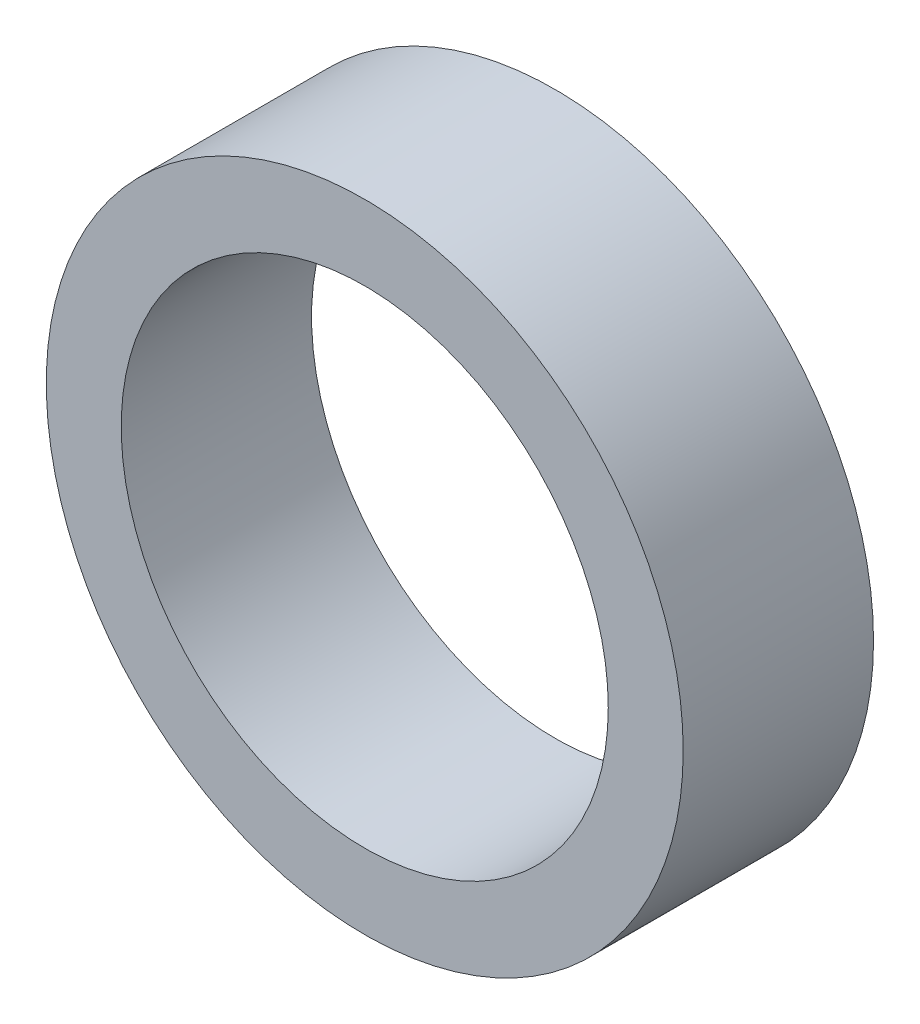
ISO-10303-21;
HEADER;
FILE_DESCRIPTION(('STEP AP214'),'2;1');
FILE_NAME('part.step','',(''),(''),'','','');
FILE_SCHEMA(('AUTOMOTIVE_DESIGN { 1 0 10303 214 1 1 1 1 }'));
ENDSEC;
DATA;
#1=APPLICATION_CONTEXT('core data for automotive mechanical design processes');
#2=APPLICATION_PROTOCOL_DEFINITION('international standard','automotive_design',2000,#1);
#3=PRODUCT_CONTEXT('',#1,'mechanical');
#4=PRODUCT('Part','Part','',(#3));
#5=PRODUCT_RELATED_PRODUCT_CATEGORY('part','',(#4));
#6=PRODUCT_DEFINITION_FORMATION('','',#4);
#7=PRODUCT_DEFINITION_CONTEXT('part definition',#1,'design');
#8=PRODUCT_DEFINITION('design','',#6,#7);
#9=PRODUCT_DEFINITION_SHAPE('','',#8);
#10=(LENGTH_UNIT() NAMED_UNIT(*) SI_UNIT(.MILLI.,.METRE.));
#11=(NAMED_UNIT(*) PLANE_ANGLE_UNIT() SI_UNIT($,.RADIAN.));
#12=(NAMED_UNIT(*) SI_UNIT($,.STERADIAN.) SOLID_ANGLE_UNIT());
#13=UNCERTAINTY_MEASURE_WITH_UNIT(LENGTH_MEASURE(1.E-05),#10,'distance_accuracy_value','');
#14=(GEOMETRIC_REPRESENTATION_CONTEXT(3) GLOBAL_UNCERTAINTY_ASSIGNED_CONTEXT((#13)) GLOBAL_UNIT_ASSIGNED_CONTEXT((#10,
#11,#12)) REPRESENTATION_CONTEXT('',''));
#15=CARTESIAN_POINT('',(0.,0.,0.));
#16=DIRECTION('',(0.,0.,1.));
#17=DIRECTION('',(1.,0.,0.));
#18=AXIS2_PLACEMENT_3D('',#15,#16,#17);
#19=CARTESIAN_POINT('',(0.,0.,2.54));
#20=DIRECTION('',(0.,0.,1.));
#21=DIRECTION('',(1.,0.,0.));
#22=AXIS2_PLACEMENT_3D('',#19,#20,#21);
#23=PLANE('',#22);
#24=CARTESIAN_POINT('',(0.,0.,2.54));
#25=DIRECTION('',(0.,0.,1.));
#26=DIRECTION('',(1.,0.,0.));
#27=AXIS2_PLACEMENT_3D('',#24,#25,#26);
#28=CIRCLE('',#27,4.25);
#29=CARTESIAN_POINT('',(4.25,0.,2.54));
#30=VERTEX_POINT('',#29);
#31=EDGE_CURVE('E10',#30,#30,#28,.T.);
#32=ORIENTED_EDGE('',*,*,#31,.T.);
#33=EDGE_LOOP('',(#32));
#34=FACE_BOUND('',#33,.T.);
#35=CARTESIAN_POINT('',(0.,0.,2.54));
#36=DIRECTION('',(0.,0.,1.));
#37=DIRECTION('',(1.,0.,0.));
#38=AXIS2_PLACEMENT_3D('',#35,#36,#37);
#39=CIRCLE('',#38,3.25);
#40=CARTESIAN_POINT('',(3.25,0.,2.54));
#41=VERTEX_POINT('',#40);
#42=EDGE_CURVE('E46',#41,#41,#39,.T.);
#43=ORIENTED_EDGE('',*,*,#42,.F.);
#44=EDGE_LOOP('',(#43));
#45=FACE_BOUND('',#44,.T.);
#46=ADVANCED_FACE('F35',(#34,#45),#23,.T.);
#47=CARTESIAN_POINT('',(0.,0.,0.));
#48=DIRECTION('',(0.,0.,1.));
#49=DIRECTION('',(1.,0.,0.));
#50=AXIS2_PLACEMENT_3D('',#47,#48,#49);
#51=PLANE('',#50);
#52=CARTESIAN_POINT('',(0.,0.,0.));
#53=DIRECTION('',(0.,0.,1.));
#54=DIRECTION('',(1.,0.,0.));
#55=AXIS2_PLACEMENT_3D('',#52,#53,#54);
#56=CIRCLE('',#55,4.25);
#57=CARTESIAN_POINT('',(4.25,0.,0.));
#58=VERTEX_POINT('',#57);
#59=EDGE_CURVE('E39',#58,#58,#56,.T.);
#60=ORIENTED_EDGE('',*,*,#59,.F.);
#61=EDGE_LOOP('',(#60));
#62=FACE_BOUND('',#61,.T.);
#63=CARTESIAN_POINT('',(0.,0.,0.));
#64=DIRECTION('',(0.,0.,1.));
#65=DIRECTION('',(1.,0.,0.));
#66=AXIS2_PLACEMENT_3D('',#63,#64,#65);
#67=CIRCLE('',#66,3.25);
#68=CARTESIAN_POINT('',(3.25,0.,0.));
#69=VERTEX_POINT('',#68);
#70=EDGE_CURVE('E48',#69,#69,#67,.T.);
#71=ORIENTED_EDGE('',*,*,#70,.T.);
#72=EDGE_LOOP('',(#71));
#73=FACE_BOUND('',#72,.T.);
#74=ADVANCED_FACE('F58',(#62,#73),#51,.F.);
#75=CARTESIAN_POINT('',(0.,0.,2.54));
#76=DIRECTION('',(0.,0.,-1.));
#77=DIRECTION('',(-1.,0.,0.));
#78=AXIS2_PLACEMENT_3D('',#75,#76,#77);
#79=CYLINDRICAL_SURFACE('',#78,4.25);
#80=ORIENTED_EDGE('',*,*,#31,.F.);
#81=EDGE_LOOP('',(#80));
#82=FACE_BOUND('',#81,.T.);
#83=ORIENTED_EDGE('',*,*,#59,.T.);
#84=EDGE_LOOP('',(#83));
#85=FACE_BOUND('',#84,.T.);
#86=ADVANCED_FACE('F37',(#82,#85),#79,.T.);
#87=CARTESIAN_POINT('',(0.,0.,2.54));
#88=DIRECTION('',(0.,0.,-1.));
#89=DIRECTION('',(-1.,0.,0.));
#90=AXIS2_PLACEMENT_3D('',#87,#88,#89);
#91=CYLINDRICAL_SURFACE('',#90,3.25);
#92=ORIENTED_EDGE('',*,*,#42,.T.);
#93=EDGE_LOOP('',(#92));
#94=FACE_BOUND('',#93,.T.);
#95=ORIENTED_EDGE('',*,*,#70,.F.);
#96=EDGE_LOOP('',(#95));
#97=FACE_BOUND('',#96,.T.);
#98=ADVANCED_FACE('F54',(#94,#97),#91,.F.);
#99=CLOSED_SHELL('',(#46,#74,#86,#98));
#100=MANIFOLD_SOLID_BREP('B2',#99);
#101=ADVANCED_BREP_SHAPE_REPRESENTATION('',(#18,#100),#14);
#102=SHAPE_DEFINITION_REPRESENTATION(#9,#101);
ENDSEC;
END-ISO-10303-21;
